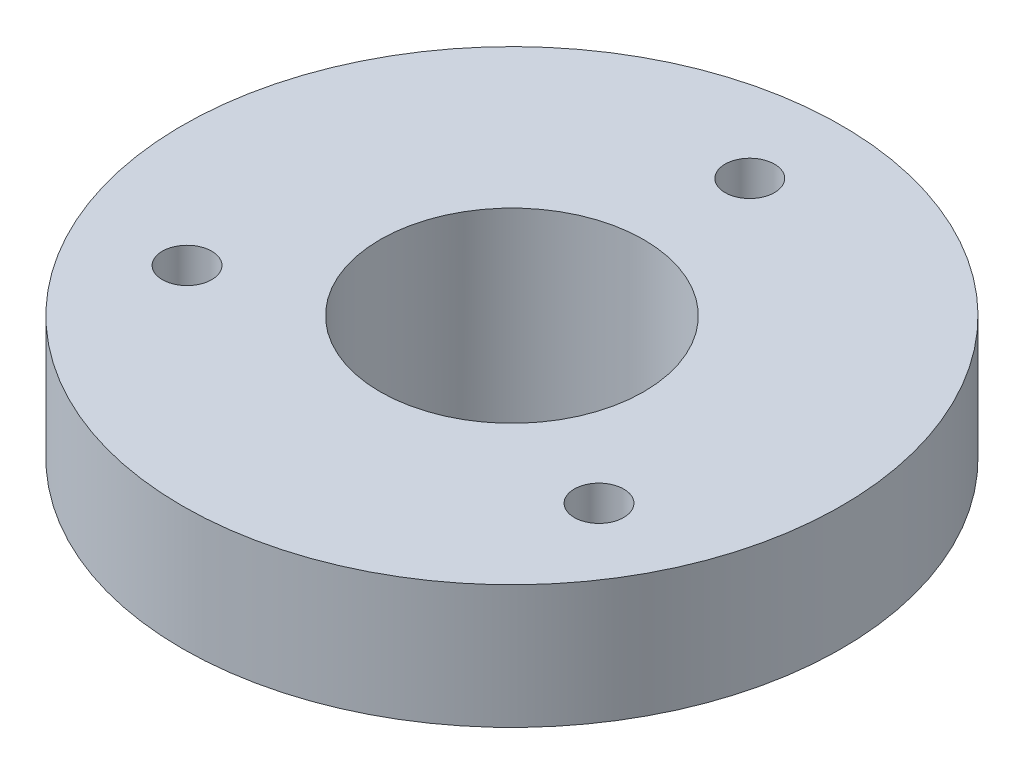
ISO-10303-21;
HEADER;
FILE_DESCRIPTION(('STEP AP214'),'2;1');
FILE_NAME('part.step','',(''),(''),'','','');
FILE_SCHEMA(('AUTOMOTIVE_DESIGN { 1 0 10303 214 1 1 1 1 }'));
ENDSEC;
DATA;
#1=APPLICATION_CONTEXT('core data for automotive mechanical design processes');
#2=APPLICATION_PROTOCOL_DEFINITION('international standard','automotive_design',2000,#1);
#3=PRODUCT_CONTEXT('',#1,'mechanical');
#4=PRODUCT('Part','Part','',(#3));
#5=PRODUCT_RELATED_PRODUCT_CATEGORY('part','',(#4));
#6=PRODUCT_DEFINITION_FORMATION('','',#4);
#7=PRODUCT_DEFINITION_CONTEXT('part definition',#1,'design');
#8=PRODUCT_DEFINITION('design','',#6,#7);
#9=PRODUCT_DEFINITION_SHAPE('','',#8);
#10=(LENGTH_UNIT() NAMED_UNIT(*) SI_UNIT(.MILLI.,.METRE.));
#11=(NAMED_UNIT(*) PLANE_ANGLE_UNIT() SI_UNIT($,.RADIAN.));
#12=(NAMED_UNIT(*) SI_UNIT($,.STERADIAN.) SOLID_ANGLE_UNIT());
#13=UNCERTAINTY_MEASURE_WITH_UNIT(LENGTH_MEASURE(1.E-05),#10,'distance_accuracy_value','');
#14=(GEOMETRIC_REPRESENTATION_CONTEXT(3) GLOBAL_UNCERTAINTY_ASSIGNED_CONTEXT((#13)) GLOBAL_UNIT_ASSIGNED_CONTEXT((#10,
#11,#12)) REPRESENTATION_CONTEXT('',''));
#15=CARTESIAN_POINT('',(0.,0.,0.));
#16=DIRECTION('',(0.,0.,1.));
#17=DIRECTION('',(1.,0.,0.));
#18=AXIS2_PLACEMENT_3D('',#15,#16,#17);
#19=CARTESIAN_POINT('',(0.,0.,0.));
#20=DIRECTION('',(0.,1.,0.));
#21=DIRECTION('',(0.,0.,1.));
#22=AXIS2_PLACEMENT_3D('',#19,#20,#21);
#23=PLANE('',#22);
#24=CARTESIAN_POINT('',(0.,0.,0.));
#25=DIRECTION('',(0.,1.,0.));
#26=DIRECTION('',(0.,0.,1.));
#27=AXIS2_PLACEMENT_3D('',#24,#25,#26);
#28=CIRCLE('',#27,8.49999999999999);
#29=CARTESIAN_POINT('',(0.,0.,8.49999999999999));
#30=VERTEX_POINT('',#29);
#31=EDGE_CURVE('E41',#30,#30,#28,.T.);
#32=ORIENTED_EDGE('',*,*,#31,.T.);
#33=EDGE_LOOP('',(#32));
#34=FACE_BOUND('',#33,.T.);
#35=CARTESIAN_POINT('',(-10.,0.,5.77350269189626));
#36=DIRECTION('',(0.,1.,0.));
#37=DIRECTION('',(0.,0.,1.));
#38=AXIS2_PLACEMENT_3D('',#35,#36,#37);
#39=CIRCLE('',#38,1.2);
#40=CARTESIAN_POINT('',(-10.,0.,6.97350269189626));
#41=VERTEX_POINT('',#40);
#42=EDGE_CURVE('E72',#41,#41,#39,.T.);
#43=ORIENTED_EDGE('',*,*,#42,.T.);
#44=EDGE_LOOP('',(#43));
#45=FACE_BOUND('',#44,.T.);
#46=CARTESIAN_POINT('',(0.,0.,-11.5470053837925));
#47=DIRECTION('',(0.,1.,0.));
#48=DIRECTION('',(0.,0.,1.));
#49=AXIS2_PLACEMENT_3D('',#46,#47,#48);
#50=CIRCLE('',#49,1.2);
#51=CARTESIAN_POINT('',(0.,0.,-10.3470053837925));
#52=VERTEX_POINT('',#51);
#53=EDGE_CURVE('E60',#52,#52,#50,.T.);
#54=ORIENTED_EDGE('',*,*,#53,.T.);
#55=EDGE_LOOP('',(#54));
#56=FACE_BOUND('',#55,.T.);
#57=CARTESIAN_POINT('',(0.,0.,0.));
#58=DIRECTION('',(0.,1.,0.));
#59=DIRECTION('',(0.,0.,1.));
#60=AXIS2_PLACEMENT_3D('',#57,#58,#59);
#61=CIRCLE('',#60,16.);
#62=CARTESIAN_POINT('',(0.,0.,16.));
#63=VERTEX_POINT('',#62);
#64=EDGE_CURVE('E51',#63,#63,#61,.T.);
#65=ORIENTED_EDGE('',*,*,#64,.F.);
#66=EDGE_LOOP('',(#65));
#67=FACE_BOUND('',#66,.T.);
#68=CARTESIAN_POINT('',(10.,0.,5.77350269189625));
#69=DIRECTION('',(0.,1.,0.));
#70=DIRECTION('',(0.,0.,1.));
#71=AXIS2_PLACEMENT_3D('',#68,#69,#70);
#72=CIRCLE('',#71,1.2);
#73=CARTESIAN_POINT('',(10.,0.,6.97350269189625));
#74=VERTEX_POINT('',#73);
#75=EDGE_CURVE('E66',#74,#74,#72,.T.);
#76=ORIENTED_EDGE('',*,*,#75,.T.);
#77=EDGE_LOOP('',(#76));
#78=FACE_BOUND('',#77,.T.);
#79=ADVANCED_FACE('F30',(#34,#45,#56,#67,#78),#23,.F.);
#80=CARTESIAN_POINT('',(0.,6.,0.));
#81=DIRECTION('',(0.,1.,0.));
#82=DIRECTION('',(0.,0.,1.));
#83=AXIS2_PLACEMENT_3D('',#80,#81,#82);
#84=PLANE('',#83);
#85=CARTESIAN_POINT('',(10.,6.,5.77350269189625));
#86=DIRECTION('',(0.,1.,0.));
#87=DIRECTION('',(0.,0.,1.));
#88=AXIS2_PLACEMENT_3D('',#85,#86,#87);
#89=CIRCLE('',#88,1.2);
#90=CARTESIAN_POINT('',(10.,6.,6.97350269189625));
#91=VERTEX_POINT('',#90);
#92=EDGE_CURVE('E63',#91,#91,#89,.T.);
#93=ORIENTED_EDGE('',*,*,#92,.F.);
#94=EDGE_LOOP('',(#93));
#95=FACE_BOUND('',#94,.T.);
#96=CARTESIAN_POINT('',(0.,6.,0.));
#97=DIRECTION('',(0.,1.,0.));
#98=DIRECTION('',(0.,0.,1.));
#99=AXIS2_PLACEMENT_3D('',#96,#97,#98);
#100=CIRCLE('',#99,6.4);
#101=CARTESIAN_POINT('',(0.,6.,6.4));
#102=VERTEX_POINT('',#101);
#103=EDGE_CURVE('E54',#102,#102,#100,.T.);
#104=ORIENTED_EDGE('',*,*,#103,.F.);
#105=EDGE_LOOP('',(#104));
#106=FACE_BOUND('',#105,.T.);
#107=CARTESIAN_POINT('',(0.,6.,0.));
#108=DIRECTION('',(0.,1.,0.));
#109=DIRECTION('',(0.,0.,1.));
#110=AXIS2_PLACEMENT_3D('',#107,#108,#109);
#111=CIRCLE('',#110,16.);
#112=CARTESIAN_POINT('',(0.,6.,16.));
#113=VERTEX_POINT('',#112);
#114=EDGE_CURVE('E50',#113,#113,#111,.T.);
#115=ORIENTED_EDGE('',*,*,#114,.T.);
#116=EDGE_LOOP('',(#115));
#117=FACE_BOUND('',#116,.T.);
#118=CARTESIAN_POINT('',(0.,6.,-11.5470053837925));
#119=DIRECTION('',(0.,1.,0.));
#120=DIRECTION('',(0.,0.,1.));
#121=AXIS2_PLACEMENT_3D('',#118,#119,#120);
#122=CIRCLE('',#121,1.2);
#123=CARTESIAN_POINT('',(0.,6.,-10.3470053837925));
#124=VERTEX_POINT('',#123);
#125=EDGE_CURVE('E59',#124,#124,#122,.T.);
#126=ORIENTED_EDGE('',*,*,#125,.F.);
#127=EDGE_LOOP('',(#126));
#128=FACE_BOUND('',#127,.T.);
#129=CARTESIAN_POINT('',(-10.,6.,5.77350269189626));
#130=DIRECTION('',(0.,1.,0.));
#131=DIRECTION('',(0.,0.,1.));
#132=AXIS2_PLACEMENT_3D('',#129,#130,#131);
#133=CIRCLE('',#132,1.2);
#134=CARTESIAN_POINT('',(-10.,6.,6.97350269189626));
#135=VERTEX_POINT('',#134);
#136=EDGE_CURVE('E69',#135,#135,#133,.T.);
#137=ORIENTED_EDGE('',*,*,#136,.F.);
#138=EDGE_LOOP('',(#137));
#139=FACE_BOUND('',#138,.T.);
#140=ADVANCED_FACE('F97',(#95,#106,#117,#128,#139),#84,.T.);
#141=CARTESIAN_POINT('',(0.,6.,0.));
#142=DIRECTION('',(0.,-1.,0.));
#143=DIRECTION('',(0.,0.,-1.));
#144=AXIS2_PLACEMENT_3D('',#141,#142,#143);
#145=CYLINDRICAL_SURFACE('',#144,16.);
#146=ORIENTED_EDGE('',*,*,#114,.F.);
#147=EDGE_LOOP('',(#146));
#148=FACE_BOUND('',#147,.T.);
#149=ORIENTED_EDGE('',*,*,#64,.T.);
#150=EDGE_LOOP('',(#149));
#151=FACE_BOUND('',#150,.T.);
#152=ADVANCED_FACE('F103',(#148,#151),#145,.T.);
#153=CARTESIAN_POINT('',(0.,6.,0.));
#154=DIRECTION('',(0.,-1.,0.));
#155=DIRECTION('',(0.,0.,-1.));
#156=AXIS2_PLACEMENT_3D('',#153,#154,#155);
#157=CYLINDRICAL_SURFACE('',#156,6.4);
#158=CARTESIAN_POINT('',(0.,-3.49999999999999,0.));
#159=DIRECTION('',(0.,-1.,0.));
#160=DIRECTION('',(0.,0.,-1.));
#161=AXIS2_PLACEMENT_3D('',#158,#159,#160);
#162=CIRCLE('',#161,6.4);
#163=CARTESIAN_POINT('',(0.,-3.49999999999999,-6.4));
#164=VERTEX_POINT('',#163);
#165=EDGE_CURVE('E37',#164,#164,#162,.T.);
#166=ORIENTED_EDGE('',*,*,#165,.T.);
#167=EDGE_LOOP('',(#166));
#168=FACE_BOUND('',#167,.T.);
#169=ORIENTED_EDGE('',*,*,#103,.T.);
#170=EDGE_LOOP('',(#169));
#171=FACE_BOUND('',#170,.T.);
#172=ADVANCED_FACE('F110',(#168,#171),#157,.F.);
#173=CARTESIAN_POINT('',(0.,6.,-11.5470053837925));
#174=DIRECTION('',(0.,-1.,0.));
#175=DIRECTION('',(0.,0.,-1.));
#176=AXIS2_PLACEMENT_3D('',#173,#174,#175);
#177=CYLINDRICAL_SURFACE('',#176,1.2);
#178=ORIENTED_EDGE('',*,*,#125,.T.);
#179=EDGE_LOOP('',(#178));
#180=FACE_BOUND('',#179,.T.);
#181=ORIENTED_EDGE('',*,*,#53,.F.);
#182=EDGE_LOOP('',(#181));
#183=FACE_BOUND('',#182,.T.);
#184=ADVANCED_FACE('F115',(#180,#183),#177,.F.);
#185=CARTESIAN_POINT('',(10.,6.,5.77350269189625));
#186=DIRECTION('',(0.,-1.,0.));
#187=DIRECTION('',(0.,0.,-1.));
#188=AXIS2_PLACEMENT_3D('',#185,#186,#187);
#189=CYLINDRICAL_SURFACE('',#188,1.2);
#190=ORIENTED_EDGE('',*,*,#92,.T.);
#191=EDGE_LOOP('',(#190));
#192=FACE_BOUND('',#191,.T.);
#193=ORIENTED_EDGE('',*,*,#75,.F.);
#194=EDGE_LOOP('',(#193));
#195=FACE_BOUND('',#194,.T.);
#196=ADVANCED_FACE('F123',(#192,#195),#189,.F.);
#197=CARTESIAN_POINT('',(-10.,6.,5.77350269189626));
#198=DIRECTION('',(0.,-1.,0.));
#199=DIRECTION('',(0.,0.,-1.));
#200=AXIS2_PLACEMENT_3D('',#197,#198,#199);
#201=CYLINDRICAL_SURFACE('',#200,1.2);
#202=ORIENTED_EDGE('',*,*,#136,.T.);
#203=EDGE_LOOP('',(#202));
#204=FACE_BOUND('',#203,.T.);
#205=ORIENTED_EDGE('',*,*,#42,.F.);
#206=EDGE_LOOP('',(#205));
#207=FACE_BOUND('',#206,.T.);
#208=ADVANCED_FACE('F93',(#204,#207),#201,.F.);
#209=CARTESIAN_POINT('',(0.,-4.,0.));
#210=DIRECTION('',(0.,-1.,0.));
#211=DIRECTION('',(0.,0.,-1.));
#212=AXIS2_PLACEMENT_3D('',#209,#210,#211);
#213=PLANE('',#212);
#214=CARTESIAN_POINT('',(0.,-4.,0.));
#215=DIRECTION('',(0.,-1.,0.));
#216=DIRECTION('',(0.,0.,-1.));
#217=AXIS2_PLACEMENT_3D('',#214,#215,#216);
#218=CIRCLE('',#217,6.90000000000002);
#219=CARTESIAN_POINT('',(0.,-4.,-6.90000000000002));
#220=VERTEX_POINT('',#219);
#221=EDGE_CURVE('E10',#220,#220,#218,.F.);
#222=ORIENTED_EDGE('',*,*,#221,.T.);
#223=EDGE_LOOP('',(#222));
#224=FACE_BOUND('',#223,.T.);
#225=CARTESIAN_POINT('',(0.,-4.,0.));
#226=DIRECTION('',(0.,-1.,0.));
#227=DIRECTION('',(0.,0.,-1.));
#228=AXIS2_PLACEMENT_3D('',#225,#226,#227);
#229=CIRCLE('',#228,8.);
#230=CARTESIAN_POINT('',(0.,-4.,-8.));
#231=VERTEX_POINT('',#230);
#232=EDGE_CURVE('E75',#231,#231,#229,.T.);
#233=ORIENTED_EDGE('',*,*,#232,.T.);
#234=EDGE_LOOP('',(#233));
#235=FACE_BOUND('',#234,.T.);
#236=ADVANCED_FACE('F81',(#224,#235),#213,.T.);
#237=CARTESIAN_POINT('',(0.,-4.,0.));
#238=DIRECTION('',(0.,1.,0.));
#239=DIRECTION('',(0.,0.,1.));
#240=AXIS2_PLACEMENT_3D('',#237,#238,#239);
#241=CYLINDRICAL_SURFACE('',#240,8.);
#242=CARTESIAN_POINT('',(0.,-0.5,0.));
#243=DIRECTION('',(0.,1.,0.));
#244=DIRECTION('',(0.,0.,1.));
#245=AXIS2_PLACEMENT_3D('',#242,#243,#244);
#246=CIRCLE('',#245,8.);
#247=CARTESIAN_POINT('',(0.,-0.5,8.));
#248=VERTEX_POINT('',#247);
#249=EDGE_CURVE('E45',#248,#248,#246,.F.);
#250=ORIENTED_EDGE('',*,*,#249,.T.);
#251=EDGE_LOOP('',(#250));
#252=FACE_BOUND('',#251,.T.);
#253=ORIENTED_EDGE('',*,*,#232,.F.);
#254=EDGE_LOOP('',(#253));
#255=FACE_BOUND('',#254,.T.);
#256=ADVANCED_FACE('F83',(#252,#255),#241,.T.);
#257=CARTESIAN_POINT('',(0.,-0.5,0.));
#258=DIRECTION('',(0.,1.,0.));
#259=DIRECTION('',(0.,0.,1.));
#260=AXIS2_PLACEMENT_3D('',#257,#258,#259);
#261=CONICAL_SURFACE('',#260,8.,0.785398163397441);
#262=ORIENTED_EDGE('',*,*,#31,.F.);
#263=EDGE_LOOP('',(#262));
#264=FACE_BOUND('',#263,.T.);
#265=ORIENTED_EDGE('',*,*,#249,.F.);
#266=EDGE_LOOP('',(#265));
#267=FACE_BOUND('',#266,.T.);
#268=ADVANCED_FACE('F85',(#264,#267),#261,.T.);
#269=CARTESIAN_POINT('',(0.,-3.49999999999999,0.));
#270=DIRECTION('',(0.,-1.,0.));
#271=DIRECTION('',(0.,0.,-1.));
#272=AXIS2_PLACEMENT_3D('',#269,#270,#271);
#273=CONICAL_SURFACE('',#272,6.4,0.785398163397454);
#274=ORIENTED_EDGE('',*,*,#221,.F.);
#275=EDGE_LOOP('',(#274));
#276=FACE_BOUND('',#275,.T.);
#277=ORIENTED_EDGE('',*,*,#165,.F.);
#278=EDGE_LOOP('',(#277));
#279=FACE_BOUND('',#278,.T.);
#280=ADVANCED_FACE('F32',(#276,#279),#273,.F.);
#281=CLOSED_SHELL('',(#79,#140,#152,#172,#184,#196,#208,#236,#256,#268,#280));
#282=MANIFOLD_SOLID_BREP('B2',#281);
#283=ADVANCED_BREP_SHAPE_REPRESENTATION('',(#18,#282),#14);
#284=SHAPE_DEFINITION_REPRESENTATION(#9,#283);
ENDSEC;
END-ISO-10303-21;
